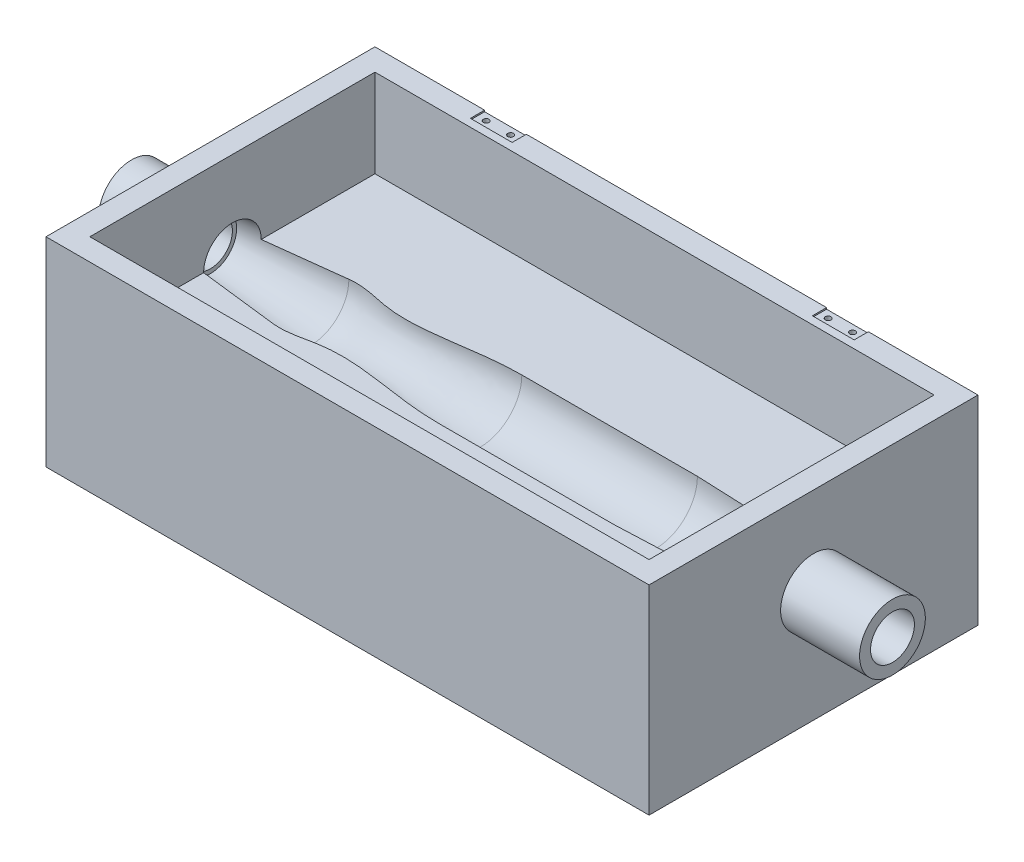
ISO-10303-21;
HEADER;
FILE_DESCRIPTION(('STEP AP214'),'2;1');
FILE_NAME('part.step','',(''),(''),'','','');
FILE_SCHEMA(('AUTOMOTIVE_DESIGN { 1 0 10303 214 1 1 1 1 }'));
ENDSEC;
DATA;
#1=APPLICATION_CONTEXT('core data for automotive mechanical design processes');
#2=APPLICATION_PROTOCOL_DEFINITION('international standard','automotive_design',2000,#1);
#3=PRODUCT_CONTEXT('',#1,'mechanical');
#4=PRODUCT('Part','Part','',(#3));
#5=PRODUCT_RELATED_PRODUCT_CATEGORY('part','',(#4));
#6=PRODUCT_DEFINITION_FORMATION('','',#4);
#7=PRODUCT_DEFINITION_CONTEXT('part definition',#1,'design');
#8=PRODUCT_DEFINITION('design','',#6,#7);
#9=PRODUCT_DEFINITION_SHAPE('','',#8);
#10=(LENGTH_UNIT() NAMED_UNIT(*) SI_UNIT(.MILLI.,.METRE.));
#11=(NAMED_UNIT(*) PLANE_ANGLE_UNIT() SI_UNIT($,.RADIAN.));
#12=(NAMED_UNIT(*) SI_UNIT($,.STERADIAN.) SOLID_ANGLE_UNIT());
#13=UNCERTAINTY_MEASURE_WITH_UNIT(LENGTH_MEASURE(1.E-05),#10,'distance_accuracy_value','');
#14=(GEOMETRIC_REPRESENTATION_CONTEXT(3) GLOBAL_UNCERTAINTY_ASSIGNED_CONTEXT((#13)) GLOBAL_UNIT_ASSIGNED_CONTEXT((#10,
#11,#12)) REPRESENTATION_CONTEXT('',''));
#15=CARTESIAN_POINT('',(0.,0.,0.));
#16=DIRECTION('',(0.,0.,1.));
#17=DIRECTION('',(1.,0.,0.));
#18=AXIS2_PLACEMENT_3D('',#15,#16,#17);
#19=CARTESIAN_POINT('',(137.5,0.,-75.));
#20=DIRECTION('',(1.,0.,0.));
#21=DIRECTION('',(0.,0.,-1.));
#22=AXIS2_PLACEMENT_3D('',#19,#20,#21);
#23=PLANE('',#22);
#24=CARTESIAN_POINT('',(137.5,0.,0.));
#25=DIRECTION('',(-1.,0.,0.));
#26=DIRECTION('',(0.,-1.,0.));
#27=AXIS2_PLACEMENT_3D('',#24,#25,#26);
#28=CIRCLE('',#27,7.747);
#29=CARTESIAN_POINT('',(137.5,-7.74699999999995,0.));
#30=VERTEX_POINT('',#29);
#31=EDGE_CURVE('E424',#30,#30,#28,.T.);
#32=ORIENTED_EDGE('',*,*,#31,.T.);
#33=EDGE_LOOP('',(#32));
#34=FACE_BOUND('',#33,.T.);
#35=CARTESIAN_POINT('',(137.5,0.,0.));
#36=DIRECTION('',(1.,0.,0.));
#37=DIRECTION('',(0.,0.,-1.));
#38=AXIS2_PLACEMENT_3D('',#35,#36,#37);
#39=CIRCLE('',#38,10.);
#40=CARTESIAN_POINT('',(137.5,0.,-10.));
#41=VERTEX_POINT('',#40);
#42=EDGE_CURVE('E53',#41,#41,#39,.F.);
#43=ORIENTED_EDGE('',*,*,#42,.F.);
#44=EDGE_LOOP('',(#43));
#45=FACE_BOUND('',#44,.T.);
#46=ADVANCED_FACE('F44',(#34,#45),#23,.T.);
#47=CARTESIAN_POINT('',(-137.5,0.,-75.));
#48=DIRECTION('',(0.,1.,0.));
#49=DIRECTION('',(-1.,0.,0.));
#50=AXIS2_PLACEMENT_3D('',#47,#48,#49);
#51=PLANE('',#50);
#52=DIRECTION('',(0.,0.,1.));
#53=VECTOR('',#52,1.);
#54=CARTESIAN_POINT('',(-127.5,0.,-65.));
#55=LINE('',#54,#53);
#56=CARTESIAN_POINT('',(-127.5,0.,-65.));
#57=VERTEX_POINT('',#56);
#58=CARTESIAN_POINT('',(-127.5,0.,-13.1324444444444));
#59=VERTEX_POINT('',#58);
#60=EDGE_CURVE('E565',#57,#59,#55,.T.);
#61=ORIENTED_EDGE('',*,*,#60,.T.);
#62=DIRECTION('',(-0.992941946001955,0.,0.118601399105789));
#63=VECTOR('',#62,1.);
#64=CARTESIAN_POINT('',(-237.446046511628,0.,0.));
#65=LINE('',#64,#63);
#66=CARTESIAN_POINT('',(-91.78,0.,-17.399));
#67=VERTEX_POINT('',#66);
#68=EDGE_CURVE('E429',#59,#67,#65,.F.);
#69=ORIENTED_EDGE('',*,*,#68,.T.);
#70=CARTESIAN_POINT('',(-14.564,0.,-19.05));
#71=CARTESIAN_POINT('',(-35.8294470897162,0.,-19.05));
#72=CARTESIAN_POINT('',(-60.549292723355,0.,-10.0128053188379));
#73=CARTESIAN_POINT('',(-84.9013365409294,0.,-18.220618135389));
#74=CARTESIAN_POINT('',(-91.78,0.,-17.399));
#75=B_SPLINE_CURVE_WITH_KNOTS('',3,(#70,#71,#72,#73,#74),.UNSPECIFIED.,.F.,.F.,(4,1,4),(0.,
0.755761848674318,1.),.UNSPECIFIED.);
#76=CARTESIAN_POINT('',(-14.564,0.,-19.05));
#77=VERTEX_POINT('',#76);
#78=EDGE_CURVE('E451',#67,#77,#75,.F.);
#79=ORIENTED_EDGE('',*,*,#78,.T.);
#80=DIRECTION('',(-1.,0.,0.));
#81=VECTOR('',#80,1.);
#82=CARTESIAN_POINT('',(-137.5,0.,-19.05));
#83=LINE('',#82,#81);
#84=CARTESIAN_POINT('',(65.5,0.,-19.05));
#85=VERTEX_POINT('',#84);
#86=EDGE_CURVE('E447',#77,#85,#83,.F.);
#87=ORIENTED_EDGE('',*,*,#86,.T.);
#88=DIRECTION('',(-0.999108513517014,0.,-0.0422158526838177));
#89=VECTOR('',#88,1.);
#90=CARTESIAN_POINT('',(516.349999999998,1.31985331754756E-13,0.));
#91=LINE('',#90,#89);
#92=CARTESIAN_POINT('',(119.602,0.,-16.764));
#93=VERTEX_POINT('',#92);
#94=EDGE_CURVE('E440',#85,#93,#91,.F.);
#95=ORIENTED_EDGE('',*,*,#94,.T.);
#96=CARTESIAN_POINT('',(137.5,0.,-7.747));
#97=CARTESIAN_POINT('',(137.5,0.,-12.322795174278));
#98=CARTESIAN_POINT('',(132.251729161469,0.,-15.7307599018355));
#99=CARTESIAN_POINT('',(126.446685513367,0.,-16.4747879360549));
#100=CARTESIAN_POINT('',(119.602,0.,-16.764));
#101=B_SPLINE_CURVE_WITH_KNOTS('',3,(#96,#97,#98,#99,#100),.UNSPECIFIED.,.F.,.F.,(4,1,4),(0.,
0.343752138132964,1.),.UNSPECIFIED.);
#102=CARTESIAN_POINT('',(127.5,0.,-16.1305760059969));
#103=VERTEX_POINT('',#102);
#104=EDGE_CURVE('E432',#93,#103,#101,.F.);
#105=ORIENTED_EDGE('',*,*,#104,.T.);
#106=DIRECTION('',(0.,0.,-1.));
#107=VECTOR('',#106,1.);
#108=CARTESIAN_POINT('',(127.5,0.,65.));
#109=LINE('',#108,#107);
#110=CARTESIAN_POINT('',(127.5,0.,-65.));
#111=VERTEX_POINT('',#110);
#112=EDGE_CURVE('E561',#103,#111,#109,.T.);
#113=ORIENTED_EDGE('',*,*,#112,.T.);
#114=DIRECTION('',(-1.,0.,0.));
#115=VECTOR('',#114,1.);
#116=CARTESIAN_POINT('',(-127.5,0.,-65.));
#117=LINE('',#116,#115);
#118=EDGE_CURVE('E553',#111,#57,#117,.T.);
#119=ORIENTED_EDGE('',*,*,#118,.T.);
#120=EDGE_LOOP('',(#61,#69,#79,#87,#95,#105,#113,#119));
#121=FACE_BOUND('',#120,.T.);
#122=ADVANCED_FACE('F406',(#121),#51,.T.);
#123=CARTESIAN_POINT('',(-14.564,0.,19.05));
#124=CARTESIAN_POINT('',(-35.8294470897162,0.,19.05));
#125=CARTESIAN_POINT('',(-60.549292723355,0.,10.0128053188379));
#126=CARTESIAN_POINT('',(-84.9013365409294,0.,18.220618135389));
#127=CARTESIAN_POINT('',(-91.78,0.,17.399));
#128=B_SPLINE_CURVE_WITH_KNOTS('',3,(#123,#124,#125,#126,#127),.UNSPECIFIED.,.F.,.F.,(4,1,4),
(0.,0.755761848674318,1.),.UNSPECIFIED.);
#129=CARTESIAN_POINT('',(-14.564,0.,19.05));
#130=VERTEX_POINT('',#129);
#131=CARTESIAN_POINT('',(-91.78,0.,17.399));
#132=VERTEX_POINT('',#131);
#133=EDGE_CURVE('E481',#130,#132,#128,.T.);
#134=ORIENTED_EDGE('',*,*,#133,.T.);
#135=DIRECTION('',(0.992941946001955,0.,0.118601399105789));
#136=VECTOR('',#135,1.);
#137=CARTESIAN_POINT('',(-237.446046511628,0.,0.));
#138=LINE('',#137,#136);
#139=CARTESIAN_POINT('',(-127.5,0.,13.1324444444444));
#140=VERTEX_POINT('',#139);
#141=EDGE_CURVE('E457',#132,#140,#138,.F.);
#142=ORIENTED_EDGE('',*,*,#141,.T.);
#143=CARTESIAN_POINT('',(-127.5,0.,65.));
#144=VERTEX_POINT('',#143);
#145=EDGE_CURVE('E569',#140,#144,#55,.T.);
#146=ORIENTED_EDGE('',*,*,#145,.T.);
#147=DIRECTION('',(1.,0.,0.));
#148=VECTOR('',#147,1.);
#149=CARTESIAN_POINT('',(-127.5,0.,65.));
#150=LINE('',#149,#148);
#151=CARTESIAN_POINT('',(127.5,0.,65.));
#152=VERTEX_POINT('',#151);
#153=EDGE_CURVE('E562',#144,#152,#150,.T.);
#154=ORIENTED_EDGE('',*,*,#153,.T.);
#155=CARTESIAN_POINT('',(127.500000000005,0.,16.1305760059962));
#156=VERTEX_POINT('',#155);
#157=EDGE_CURVE('E557',#152,#156,#109,.T.);
#158=ORIENTED_EDGE('',*,*,#157,.T.);
#159=CARTESIAN_POINT('',(137.5,0.,7.747));
#160=CARTESIAN_POINT('',(137.5,0.,12.322795174278));
#161=CARTESIAN_POINT('',(132.251729161469,0.,15.7307599018355));
#162=CARTESIAN_POINT('',(126.446685513367,0.,16.4747879360549));
#163=CARTESIAN_POINT('',(119.602,0.,16.764));
#164=B_SPLINE_CURVE_WITH_KNOTS('',3,(#159,#160,#161,#162,#163),.UNSPECIFIED.,.F.,.F.,(4,1,4),
(0.,0.343752138132964,1.),.UNSPECIFIED.);
#165=CARTESIAN_POINT('',(119.602,0.,16.764));
#166=VERTEX_POINT('',#165);
#167=EDGE_CURVE('E464',#156,#166,#164,.T.);
#168=ORIENTED_EDGE('',*,*,#167,.T.);
#169=DIRECTION('',(0.999108513517014,0.,-0.0422158526838177));
#170=VECTOR('',#169,1.);
#171=CARTESIAN_POINT('',(516.349999999998,1.31985331754756E-13,0.));
#172=LINE('',#171,#170);
#173=CARTESIAN_POINT('',(65.5,0.,19.05));
#174=VERTEX_POINT('',#173);
#175=EDGE_CURVE('E470',#166,#174,#172,.F.);
#176=ORIENTED_EDGE('',*,*,#175,.T.);
#177=DIRECTION('',(-1.,0.,0.));
#178=VECTOR('',#177,1.);
#179=CARTESIAN_POINT('',(-137.5,0.,19.05));
#180=LINE('',#179,#178);
#181=EDGE_CURVE('E477',#174,#130,#180,.T.);
#182=ORIENTED_EDGE('',*,*,#181,.T.);
#183=EDGE_LOOP('',(#134,#142,#146,#154,#158,#168,#176,#182));
#184=FACE_BOUND('',#183,.T.);
#185=ADVANCED_FACE('F408',(#184),#51,.T.);
#186=CARTESIAN_POINT('',(137.5,-50.8,-75.));
#187=DIRECTION('',(0.,-1.,0.));
#188=DIRECTION('',(1.,0.,0.));
#189=AXIS2_PLACEMENT_3D('',#186,#187,#188);
#190=PLANE('',#189);
#191=DIRECTION('',(0.,0.,1.));
#192=VECTOR('',#191,1.);
#193=CARTESIAN_POINT('',(137.5,-50.8,-75.));
#194=LINE('',#193,#192);
#195=CARTESIAN_POINT('',(137.5,-50.8,-75.));
#196=VERTEX_POINT('',#195);
#197=CARTESIAN_POINT('',(137.5,-50.8,75.));
#198=VERTEX_POINT('',#197);
#199=EDGE_CURVE('E488',#196,#198,#194,.T.);
#200=ORIENTED_EDGE('',*,*,#199,.T.);
#201=DIRECTION('',(1.,0.,0.));
#202=VECTOR('',#201,1.);
#203=CARTESIAN_POINT('',(137.5,-50.8,75.));
#204=LINE('',#203,#202);
#205=CARTESIAN_POINT('',(-137.5,-50.8,75.));
#206=VERTEX_POINT('',#205);
#207=EDGE_CURVE('E514',#206,#198,#204,.T.);
#208=ORIENTED_EDGE('',*,*,#207,.F.);
#209=DIRECTION('',(0.,0.,1.));
#210=VECTOR('',#209,1.);
#211=CARTESIAN_POINT('',(-137.5,-50.8,-75.));
#212=LINE('',#211,#210);
#213=CARTESIAN_POINT('',(-137.5,-50.8,-75.));
#214=VERTEX_POINT('',#213);
#215=EDGE_CURVE('E487',#214,#206,#212,.T.);
#216=ORIENTED_EDGE('',*,*,#215,.F.);
#217=DIRECTION('',(1.,0.,0.));
#218=VECTOR('',#217,1.);
#219=CARTESIAN_POINT('',(137.5,-50.8,-75.));
#220=LINE('',#219,#218);
#221=EDGE_CURVE('E503',#214,#196,#220,.T.);
#222=ORIENTED_EDGE('',*,*,#221,.T.);
#223=EDGE_LOOP('',(#200,#208,#216,#222));
#224=FACE_BOUND('',#223,.T.);
#225=ADVANCED_FACE('F46',(#224),#190,.T.);
#226=CARTESIAN_POINT('',(-137.5,-50.8,-75.));
#227=DIRECTION('',(-1.,0.,0.));
#228=DIRECTION('',(0.,0.,1.));
#229=AXIS2_PLACEMENT_3D('',#226,#227,#228);
#230=PLANE('',#229);
#231=CARTESIAN_POINT('',(-137.5,0.,0.));
#232=DIRECTION('',(-1.,0.,0.));
#233=DIRECTION('',(0.,0.,1.));
#234=AXIS2_PLACEMENT_3D('',#231,#232,#233);
#235=CIRCLE('',#234,15.);
#236=CARTESIAN_POINT('',(-137.5,0.,15.));
#237=VERTEX_POINT('',#236);
#238=EDGE_CURVE('E11',#237,#237,#235,.T.);
#239=ORIENTED_EDGE('',*,*,#238,.F.);
#240=EDGE_LOOP('',(#239));
#241=FACE_BOUND('',#240,.T.);
#242=ORIENTED_EDGE('',*,*,#215,.T.);
#243=DIRECTION('',(0.,-1.,0.));
#244=VECTOR('',#243,1.);
#245=CARTESIAN_POINT('',(-137.5,-50.8,75.));
#246=LINE('',#245,#244);
#247=CARTESIAN_POINT('',(-137.5,40.132,75.));
#248=VERTEX_POINT('',#247);
#249=EDGE_CURVE('E507',#248,#206,#246,.T.);
#250=ORIENTED_EDGE('',*,*,#249,.F.);
#251=DIRECTION('',(0.,0.,1.));
#252=VECTOR('',#251,1.);
#253=CARTESIAN_POINT('',(-137.5,40.132,-75.));
#254=LINE('',#253,#252);
#255=CARTESIAN_POINT('',(-137.5,40.132,-75.));
#256=VERTEX_POINT('',#255);
#257=EDGE_CURVE('E532',#256,#248,#254,.T.);
#258=ORIENTED_EDGE('',*,*,#257,.F.);
#259=DIRECTION('',(0.,-1.,0.));
#260=VECTOR('',#259,1.);
#261=CARTESIAN_POINT('',(-137.5,-50.8,-75.));
#262=LINE('',#261,#260);
#263=EDGE_CURVE('E494',#256,#214,#262,.T.);
#264=ORIENTED_EDGE('',*,*,#263,.T.);
#265=EDGE_LOOP('',(#242,#250,#258,#264));
#266=FACE_BOUND('',#265,.T.);
#267=ADVANCED_FACE('F402',(#241,#266),#230,.T.);
#268=CARTESIAN_POINT('',(137.5,0.,0.));
#269=DIRECTION('',(1.,0.,0.));
#270=DIRECTION('',(0.,0.,-1.));
#271=AXIS2_PLACEMENT_3D('',#268,#269,#270);
#272=CIRCLE('',#271,15.);
#273=CARTESIAN_POINT('',(137.5,0.,-15.));
#274=VERTEX_POINT('',#273);
#275=EDGE_CURVE('E341',#274,#274,#272,.T.);
#276=ORIENTED_EDGE('',*,*,#275,.F.);
#277=EDGE_LOOP('',(#276));
#278=FACE_BOUND('',#277,.T.);
#279=DIRECTION('',(0.,1.,0.));
#280=VECTOR('',#279,1.);
#281=CARTESIAN_POINT('',(137.5,0.,-75.));
#282=LINE('',#281,#280);
#283=CARTESIAN_POINT('',(137.5,40.132,-75.));
#284=VERTEX_POINT('',#283);
#285=EDGE_CURVE('E500',#196,#284,#282,.T.);
#286=ORIENTED_EDGE('',*,*,#285,.T.);
#287=DIRECTION('',(0.,0.,-1.));
#288=VECTOR('',#287,1.);
#289=CARTESIAN_POINT('',(137.5,40.132,75.));
#290=LINE('',#289,#288);
#291=CARTESIAN_POINT('',(137.5,40.132,75.));
#292=VERTEX_POINT('',#291);
#293=EDGE_CURVE('E524',#292,#284,#290,.T.);
#294=ORIENTED_EDGE('',*,*,#293,.F.);
#295=DIRECTION('',(0.,1.,0.));
#296=VECTOR('',#295,1.);
#297=CARTESIAN_POINT('',(137.5,0.,75.));
#298=LINE('',#297,#296);
#299=EDGE_CURVE('E511',#198,#292,#298,.T.);
#300=ORIENTED_EDGE('',*,*,#299,.F.);
#301=ORIENTED_EDGE('',*,*,#199,.F.);
#302=EDGE_LOOP('',(#286,#294,#300,#301));
#303=FACE_BOUND('',#302,.T.);
#304=ADVANCED_FACE('F400',(#278,#303),#23,.T.);
#305=CARTESIAN_POINT('',(0.,0.,-75.));
#306=DIRECTION('',(0.,0.,-1.));
#307=DIRECTION('',(-1.,0.,0.));
#308=AXIS2_PLACEMENT_3D('',#305,#306,#307);
#309=PLANE('',#308);
#310=DIRECTION('',(0.,1.,0.));
#311=VECTOR('',#310,1.);
#312=CARTESIAN_POINT('',(-87.5,39.492,-75.));
#313=LINE('',#312,#311);
#314=CARTESIAN_POINT('',(-87.5,39.492,-75.));
#315=VERTEX_POINT('',#314);
#316=CARTESIAN_POINT('',(-87.5,40.132,-75.));
#317=VERTEX_POINT('',#316);
#318=EDGE_CURVE('E272',#315,#317,#313,.T.);
#319=ORIENTED_EDGE('',*,*,#318,.F.);
#320=DIRECTION('',(-1.,0.,0.));
#321=VECTOR('',#320,1.);
#322=CARTESIAN_POINT('',(-87.5,39.492,-75.));
#323=LINE('',#322,#321);
#324=CARTESIAN_POINT('',(-68.45,39.492,-75.));
#325=VERTEX_POINT('',#324);
#326=EDGE_CURVE('E259',#325,#315,#323,.T.);
#327=ORIENTED_EDGE('',*,*,#326,.F.);
#328=DIRECTION('',(0.,1.,0.));
#329=VECTOR('',#328,1.);
#330=CARTESIAN_POINT('',(-68.45,39.492,-75.));
#331=LINE('',#330,#329);
#332=CARTESIAN_POINT('',(-68.45,40.132,-75.));
#333=VERTEX_POINT('',#332);
#334=EDGE_CURVE('E276',#325,#333,#331,.T.);
#335=ORIENTED_EDGE('',*,*,#334,.T.);
#336=DIRECTION('',(-1.,0.,0.));
#337=VECTOR('',#336,1.);
#338=CARTESIAN_POINT('',(-137.5,40.132,-75.));
#339=LINE('',#338,#337);
#340=CARTESIAN_POINT('',(68.45,40.132,-75.));
#341=VERTEX_POINT('',#340);
#342=EDGE_CURVE('E522',#341,#333,#339,.T.);
#343=ORIENTED_EDGE('',*,*,#342,.F.);
#344=DIRECTION('',(0.,1.,0.));
#345=VECTOR('',#344,1.);
#346=CARTESIAN_POINT('',(68.45,39.492,-75.));
#347=LINE('',#346,#345);
#348=CARTESIAN_POINT('',(68.45,39.492,-75.));
#349=VERTEX_POINT('',#348);
#350=EDGE_CURVE('E245',#349,#341,#347,.T.);
#351=ORIENTED_EDGE('',*,*,#350,.F.);
#352=DIRECTION('',(-1.,0.,0.));
#353=VECTOR('',#352,1.);
#354=CARTESIAN_POINT('',(68.45,39.492,-75.));
#355=LINE('',#354,#353);
#356=CARTESIAN_POINT('',(87.5,39.492,-75.));
#357=VERTEX_POINT('',#356);
#358=EDGE_CURVE('E288',#357,#349,#355,.T.);
#359=ORIENTED_EDGE('',*,*,#358,.F.);
#360=DIRECTION('',(0.,1.,0.));
#361=VECTOR('',#360,1.);
#362=CARTESIAN_POINT('',(87.5,39.492,-75.));
#363=LINE('',#362,#361);
#364=CARTESIAN_POINT('',(87.5,40.132,-75.));
#365=VERTEX_POINT('',#364);
#366=EDGE_CURVE('E292',#357,#365,#363,.T.);
#367=ORIENTED_EDGE('',*,*,#366,.T.);
#368=EDGE_CURVE('E518',#284,#365,#339,.T.);
#369=ORIENTED_EDGE('',*,*,#368,.F.);
#370=ORIENTED_EDGE('',*,*,#285,.F.);
#371=ORIENTED_EDGE('',*,*,#221,.F.);
#372=ORIENTED_EDGE('',*,*,#263,.F.);
#373=EDGE_CURVE('E523',#317,#256,#339,.T.);
#374=ORIENTED_EDGE('',*,*,#373,.F.);
#375=EDGE_LOOP('',(#319,#327,#335,#343,#351,#359,#367,#369,#370,#371,#372,#374));
#376=FACE_BOUND('',#375,.T.);
#377=ADVANCED_FACE('F396',(#376),#309,.T.);
#378=CARTESIAN_POINT('',(0.,0.,75.));
#379=DIRECTION('',(0.,0.,-1.));
#380=DIRECTION('',(-1.,0.,0.));
#381=AXIS2_PLACEMENT_3D('',#378,#379,#380);
#382=PLANE('',#381);
#383=ORIENTED_EDGE('',*,*,#207,.T.);
#384=ORIENTED_EDGE('',*,*,#299,.T.);
#385=DIRECTION('',(1.,0.,0.));
#386=VECTOR('',#385,1.);
#387=CARTESIAN_POINT('',(-137.5,40.132,75.));
#388=LINE('',#387,#386);
#389=EDGE_CURVE('E528',#248,#292,#388,.T.);
#390=ORIENTED_EDGE('',*,*,#389,.F.);
#391=ORIENTED_EDGE('',*,*,#249,.T.);
#392=EDGE_LOOP('',(#383,#384,#390,#391));
#393=FACE_BOUND('',#392,.T.);
#394=ADVANCED_FACE('F392',(#393),#382,.F.);
#395=CARTESIAN_POINT('',(0.,40.132,0.));
#396=DIRECTION('',(0.,1.,0.));
#397=DIRECTION('',(-1.,0.,0.));
#398=AXIS2_PLACEMENT_3D('',#395,#396,#397);
#399=PLANE('',#398);
#400=DIRECTION('',(0.,0.,1.));
#401=VECTOR('',#400,1.);
#402=CARTESIAN_POINT('',(-87.5,40.132,-75.));
#403=LINE('',#402,#401);
#404=CARTESIAN_POINT('',(-87.5,40.132,-68.52));
#405=VERTEX_POINT('',#404);
#406=EDGE_CURVE('E60',#317,#405,#403,.T.);
#407=ORIENTED_EDGE('',*,*,#406,.F.);
#408=ORIENTED_EDGE('',*,*,#373,.T.);
#409=ORIENTED_EDGE('',*,*,#257,.T.);
#410=ORIENTED_EDGE('',*,*,#389,.T.);
#411=ORIENTED_EDGE('',*,*,#293,.T.);
#412=ORIENTED_EDGE('',*,*,#368,.T.);
#413=DIRECTION('',(0.,0.,-1.));
#414=VECTOR('',#413,1.);
#415=CARTESIAN_POINT('',(87.5,40.132,-75.));
#416=LINE('',#415,#414);
#417=CARTESIAN_POINT('',(87.5,40.132,-68.52));
#418=VERTEX_POINT('',#417);
#419=EDGE_CURVE('E298',#418,#365,#416,.T.);
#420=ORIENTED_EDGE('',*,*,#419,.F.);
#421=DIRECTION('',(1.,0.,0.));
#422=VECTOR('',#421,1.);
#423=CARTESIAN_POINT('',(68.45,40.132,-68.52));
#424=LINE('',#423,#422);
#425=CARTESIAN_POINT('',(68.45,40.132,-68.52));
#426=VERTEX_POINT('',#425);
#427=EDGE_CURVE('E301',#426,#418,#424,.T.);
#428=ORIENTED_EDGE('',*,*,#427,.F.);
#429=DIRECTION('',(0.,0.,1.));
#430=VECTOR('',#429,1.);
#431=CARTESIAN_POINT('',(68.45,40.132,-75.));
#432=LINE('',#431,#430);
#433=EDGE_CURVE('E68',#341,#426,#432,.T.);
#434=ORIENTED_EDGE('',*,*,#433,.F.);
#435=ORIENTED_EDGE('',*,*,#342,.T.);
#436=DIRECTION('',(0.,0.,-1.));
#437=VECTOR('',#436,1.);
#438=CARTESIAN_POINT('',(-68.45,40.132,-75.));
#439=LINE('',#438,#437);
#440=CARTESIAN_POINT('',(-68.45,40.132,-68.52));
#441=VERTEX_POINT('',#440);
#442=EDGE_CURVE('E251',#441,#333,#439,.T.);
#443=ORIENTED_EDGE('',*,*,#442,.F.);
#444=DIRECTION('',(1.,0.,0.));
#445=VECTOR('',#444,1.);
#446=CARTESIAN_POINT('',(-87.5,40.132,-68.52));
#447=LINE('',#446,#445);
#448=EDGE_CURVE('E266',#405,#441,#447,.T.);
#449=ORIENTED_EDGE('',*,*,#448,.F.);
#450=EDGE_LOOP('',(#407,#408,#409,#410,#411,#412,#420,#428,#434,#435,#443,#449));
#451=FACE_BOUND('',#450,.T.);
#452=DIRECTION('',(1.,0.,0.));
#453=VECTOR('',#452,1.);
#454=CARTESIAN_POINT('',(-127.5,40.132,65.));
#455=LINE('',#454,#453);
#456=CARTESIAN_POINT('',(-127.5,40.132,65.));
#457=VERTEX_POINT('',#456);
#458=CARTESIAN_POINT('',(127.5,40.132,65.));
#459=VERTEX_POINT('',#458);
#460=EDGE_CURVE('E576',#457,#459,#455,.T.);
#461=ORIENTED_EDGE('',*,*,#460,.F.);
#462=DIRECTION('',(0.,0.,1.));
#463=VECTOR('',#462,1.);
#464=CARTESIAN_POINT('',(-127.5,40.132,-65.));
#465=LINE('',#464,#463);
#466=CARTESIAN_POINT('',(-127.5,40.132,-65.));
#467=VERTEX_POINT('',#466);
#468=EDGE_CURVE('E556',#467,#457,#465,.T.);
#469=ORIENTED_EDGE('',*,*,#468,.F.);
#470=DIRECTION('',(-1.,0.,0.));
#471=VECTOR('',#470,1.);
#472=CARTESIAN_POINT('',(-127.5,40.132,-65.));
#473=LINE('',#472,#471);
#474=CARTESIAN_POINT('',(127.5,40.132,-65.));
#475=VERTEX_POINT('',#474);
#476=EDGE_CURVE('E552',#475,#467,#473,.T.);
#477=ORIENTED_EDGE('',*,*,#476,.F.);
#478=DIRECTION('',(0.,0.,-1.));
#479=VECTOR('',#478,1.);
#480=CARTESIAN_POINT('',(127.5,40.132,65.));
#481=LINE('',#480,#479);
#482=EDGE_CURVE('E572',#459,#475,#481,.T.);
#483=ORIENTED_EDGE('',*,*,#482,.F.);
#484=EDGE_LOOP('',(#461,#469,#477,#483));
#485=FACE_BOUND('',#484,.T.);
#486=ADVANCED_FACE('F388',(#451,#485),#399,.T.);
#487=CARTESIAN_POINT('',(-127.5,40.132,-65.));
#488=DIRECTION('',(1.,0.,0.));
#489=DIRECTION('',(0.,1.,0.));
#490=AXIS2_PLACEMENT_3D('',#487,#488,#489);
#491=PLANE('',#490);
#492=ORIENTED_EDGE('',*,*,#145,.F.);
#493=CARTESIAN_POINT('',(-127.5,0.,0.));
#494=DIRECTION('',(1.,0.,0.));
#495=DIRECTION('',(0.,1.,0.));
#496=AXIS2_PLACEMENT_3D('',#493,#494,#495);
#497=CIRCLE('',#496,13.1324444444444);
#498=EDGE_CURVE('E581',#140,#59,#497,.F.);
#499=ORIENTED_EDGE('',*,*,#498,.T.);
#500=ORIENTED_EDGE('',*,*,#60,.F.);
#501=DIRECTION('',(0.,-1.,0.));
#502=VECTOR('',#501,1.);
#503=CARTESIAN_POINT('',(-127.5,40.132,-65.));
#504=LINE('',#503,#502);
#505=EDGE_CURVE('E548',#467,#57,#504,.T.);
#506=ORIENTED_EDGE('',*,*,#505,.F.);
#507=ORIENTED_EDGE('',*,*,#468,.T.);
#508=DIRECTION('',(0.,-1.,0.));
#509=VECTOR('',#508,1.);
#510=CARTESIAN_POINT('',(-127.5,40.132,65.));
#511=LINE('',#510,#509);
#512=EDGE_CURVE('E536',#457,#144,#511,.T.);
#513=ORIENTED_EDGE('',*,*,#512,.T.);
#514=EDGE_LOOP('',(#492,#499,#500,#506,#507,#513));
#515=FACE_BOUND('',#514,.T.);
#516=ADVANCED_FACE('F384',(#515),#491,.T.);
#517=CARTESIAN_POINT('',(-127.5,40.132,65.));
#518=DIRECTION('',(0.,0.,-1.));
#519=DIRECTION('',(-1.,0.,0.));
#520=AXIS2_PLACEMENT_3D('',#517,#518,#519);
#521=PLANE('',#520);
#522=ORIENTED_EDGE('',*,*,#153,.F.);
#523=ORIENTED_EDGE('',*,*,#512,.F.);
#524=ORIENTED_EDGE('',*,*,#460,.T.);
#525=DIRECTION('',(0.,-1.,0.));
#526=VECTOR('',#525,1.);
#527=CARTESIAN_POINT('',(127.5,40.132,65.));
#528=LINE('',#527,#526);
#529=EDGE_CURVE('E540',#459,#152,#528,.T.);
#530=ORIENTED_EDGE('',*,*,#529,.T.);
#531=EDGE_LOOP('',(#522,#523,#524,#530));
#532=FACE_BOUND('',#531,.T.);
#533=ADVANCED_FACE('F380',(#532),#521,.T.);
#534=CARTESIAN_POINT('',(127.5,40.132,65.));
#535=DIRECTION('',(-1.,0.,0.));
#536=DIRECTION('',(0.,-1.,0.));
#537=AXIS2_PLACEMENT_3D('',#534,#535,#536);
#538=PLANE('',#537);
#539=ORIENTED_EDGE('',*,*,#112,.F.);
#540=CARTESIAN_POINT('',(127.5,0.,0.));
#541=DIRECTION('',(-1.,0.,0.));
#542=DIRECTION('',(0.,-1.,0.));
#543=AXIS2_PLACEMENT_3D('',#540,#541,#542);
#544=CIRCLE('',#543,16.1305760059969);
#545=EDGE_CURVE('E585',#103,#156,#544,.F.);
#546=ORIENTED_EDGE('',*,*,#545,.T.);
#547=ORIENTED_EDGE('',*,*,#157,.F.);
#548=ORIENTED_EDGE('',*,*,#529,.F.);
#549=ORIENTED_EDGE('',*,*,#482,.T.);
#550=DIRECTION('',(0.,-1.,0.));
#551=VECTOR('',#550,1.);
#552=CARTESIAN_POINT('',(127.5,40.132,-65.));
#553=LINE('',#552,#551);
#554=EDGE_CURVE('E544',#475,#111,#553,.T.);
#555=ORIENTED_EDGE('',*,*,#554,.T.);
#556=EDGE_LOOP('',(#539,#546,#547,#548,#549,#555));
#557=FACE_BOUND('',#556,.T.);
#558=ADVANCED_FACE('F376',(#557),#538,.T.);
#559=CARTESIAN_POINT('',(-127.5,40.132,-65.));
#560=DIRECTION('',(0.,0.,1.));
#561=DIRECTION('',(1.,0.,0.));
#562=AXIS2_PLACEMENT_3D('',#559,#560,#561);
#563=PLANE('',#562);
#564=ORIENTED_EDGE('',*,*,#118,.F.);
#565=ORIENTED_EDGE('',*,*,#554,.F.);
#566=ORIENTED_EDGE('',*,*,#476,.T.);
#567=ORIENTED_EDGE('',*,*,#505,.T.);
#568=EDGE_LOOP('',(#564,#565,#566,#567));
#569=FACE_BOUND('',#568,.T.);
#570=ADVANCED_FACE('F372',(#569),#563,.T.);
#571=CARTESIAN_POINT('',(-91.78,0.,0.));
#572=DIRECTION('',(1.,0.,0.));
#573=DIRECTION('',(0.,1.,0.));
#574=AXIS2_PLACEMENT_3D('',#571,#572,#573);
#575=CONICAL_SURFACE('',#574,17.399,0.11888122095754);
#576=CARTESIAN_POINT('',(-137.5,0.,0.));
#577=DIRECTION('',(-1.,0.,0.));
#578=DIRECTION('',(0.,0.,1.));
#579=AXIS2_PLACEMENT_3D('',#576,#577,#578);
#580=CIRCLE('',#579,11.938);
#581=CARTESIAN_POINT('',(-137.5,0.,11.938));
#582=VERTEX_POINT('',#581);
#583=EDGE_CURVE('E333',#582,#582,#580,.T.);
#584=ORIENTED_EDGE('',*,*,#583,.T.);
#585=EDGE_LOOP('',(#584));
#586=FACE_BOUND('',#585,.T.);
#587=CARTESIAN_POINT('',(-91.78,0.,0.));
#588=DIRECTION('',(-1.,0.,0.));
#589=DIRECTION('',(0.,-1.,0.));
#590=AXIS2_PLACEMENT_3D('',#587,#588,#589);
#591=CIRCLE('',#590,17.399);
#592=EDGE_CURVE('E346',#67,#132,#591,.T.);
#593=ORIENTED_EDGE('',*,*,#592,.F.);
#594=ORIENTED_EDGE('',*,*,#68,.F.);
#595=ORIENTED_EDGE('',*,*,#498,.F.);
#596=ORIENTED_EDGE('',*,*,#141,.F.);
#597=EDGE_LOOP('',(#593,#594,#595,#596));
#598=FACE_BOUND('',#597,.T.);
#599=ADVANCED_FACE('F367',(#586,#598),#575,.F.);
#600=CARTESIAN_POINT('',(137.5,7.74700000000005,0.));
#601=CARTESIAN_POINT('',(137.5,12.322795174278,0.));
#602=CARTESIAN_POINT('',(132.251729161469,15.7307599018356,0.));
#603=CARTESIAN_POINT('',(126.446685513367,16.4747879360549,0.));
#604=CARTESIAN_POINT('',(119.602,16.764,0.));
#605=B_SPLINE_CURVE_WITH_KNOTS('',3,(#600,#601,#602,#603,#604),.UNSPECIFIED.,.F.,.F.,(4,1,4),
(0.,0.343752138132964,1.),.UNSPECIFIED.);
#606=CARTESIAN_POINT('',(-137.5,0.,0.));
#607=DIRECTION('',(-1.,0.,0.));
#608=AXIS1_PLACEMENT('',#606,#607);
#609=SURFACE_OF_REVOLUTION('',#605,#608);
#610=CARTESIAN_POINT('',(119.602,0.,0.));
#611=DIRECTION('',(-1.,0.,0.));
#612=DIRECTION('',(0.,-1.,0.));
#613=AXIS2_PLACEMENT_3D('',#610,#611,#612);
#614=CIRCLE('',#613,16.764);
#615=EDGE_CURVE('E591',#93,#166,#614,.T.);
#616=ORIENTED_EDGE('',*,*,#615,.T.);
#617=ORIENTED_EDGE('',*,*,#167,.F.);
#618=ORIENTED_EDGE('',*,*,#545,.F.);
#619=ORIENTED_EDGE('',*,*,#104,.F.);
#620=EDGE_LOOP('',(#616,#617,#618,#619));
#621=FACE_BOUND('',#620,.T.);
#622=ORIENTED_EDGE('',*,*,#31,.F.);
#623=EDGE_LOOP('',(#622));
#624=FACE_BOUND('',#623,.T.);
#625=ADVANCED_FACE('F362',(#621,#624),#609,.F.);
#626=CARTESIAN_POINT('',(119.602,0.,0.));
#627=DIRECTION('',(-1.,0.,0.));
#628=DIRECTION('',(0.,-1.,0.));
#629=AXIS2_PLACEMENT_3D('',#626,#627,#628);
#630=CONICAL_SURFACE('',#629,16.764,0.042228402113002);
#631=CARTESIAN_POINT('',(65.5,0.,0.));
#632=DIRECTION('',(-1.,0.,0.));
#633=DIRECTION('',(0.,-1.,0.));
#634=AXIS2_PLACEMENT_3D('',#631,#632,#633);
#635=CIRCLE('',#634,19.05);
#636=EDGE_CURVE('E595',#85,#174,#635,.T.);
#637=ORIENTED_EDGE('',*,*,#636,.T.);
#638=ORIENTED_EDGE('',*,*,#175,.F.);
#639=ORIENTED_EDGE('',*,*,#615,.F.);
#640=ORIENTED_EDGE('',*,*,#94,.F.);
#641=EDGE_LOOP('',(#637,#638,#639,#640));
#642=FACE_BOUND('',#641,.T.);
#643=ADVANCED_FACE('F366',(#642),#630,.F.);
#644=CARTESIAN_POINT('',(-137.5,0.,0.));
#645=DIRECTION('',(-1.,0.,0.));
#646=DIRECTION('',(0.,-1.,0.));
#647=AXIS2_PLACEMENT_3D('',#644,#645,#646);
#648=CYLINDRICAL_SURFACE('',#647,19.05);
#649=CARTESIAN_POINT('',(-14.564,0.,0.));
#650=DIRECTION('',(-1.,0.,0.));
#651=DIRECTION('',(0.,-1.,0.));
#652=AXIS2_PLACEMENT_3D('',#649,#650,#651);
#653=CIRCLE('',#652,19.05);
#654=EDGE_CURVE('E599',#77,#130,#653,.T.);
#655=ORIENTED_EDGE('',*,*,#654,.T.);
#656=ORIENTED_EDGE('',*,*,#181,.F.);
#657=ORIENTED_EDGE('',*,*,#636,.F.);
#658=ORIENTED_EDGE('',*,*,#86,.F.);
#659=EDGE_LOOP('',(#655,#656,#657,#658));
#660=FACE_BOUND('',#659,.T.);
#661=ADVANCED_FACE('F613',(#660),#648,.F.);
#662=CARTESIAN_POINT('',(-14.564,19.05,0.));
#663=CARTESIAN_POINT('',(-35.8294470897163,19.05,0.));
#664=CARTESIAN_POINT('',(-60.549292723355,10.0128053188379,0.));
#665=CARTESIAN_POINT('',(-84.9013365409294,18.220618135389,0.));
#666=CARTESIAN_POINT('',(-91.78,17.399,0.));
#667=B_SPLINE_CURVE_WITH_KNOTS('',3,(#662,#663,#664,#665,#666),.UNSPECIFIED.,.F.,.F.,(4,1,4),
(0.,0.755761848674318,1.),.UNSPECIFIED.);
#668=CARTESIAN_POINT('',(-137.5,0.,0.));
#669=DIRECTION('',(-1.,0.,0.));
#670=AXIS1_PLACEMENT('',#668,#669);
#671=SURFACE_OF_REVOLUTION('',#667,#670);
#672=ORIENTED_EDGE('',*,*,#592,.T.);
#673=ORIENTED_EDGE('',*,*,#133,.F.);
#674=ORIENTED_EDGE('',*,*,#654,.F.);
#675=ORIENTED_EDGE('',*,*,#78,.F.);
#676=EDGE_LOOP('',(#672,#673,#674,#675));
#677=FACE_BOUND('',#676,.T.);
#678=ADVANCED_FACE('F606',(#677),#671,.F.);
#679=CARTESIAN_POINT('',(173.5,0.,0.));
#680=DIRECTION('',(1.,0.,0.));
#681=DIRECTION('',(0.,0.,-1.));
#682=AXIS2_PLACEMENT_3D('',#679,#680,#681);
#683=PLANE('',#682);
#684=CARTESIAN_POINT('',(173.5,0.,0.));
#685=DIRECTION('',(1.,0.,0.));
#686=DIRECTION('',(0.,0.,-1.));
#687=AXIS2_PLACEMENT_3D('',#684,#685,#686);
#688=CIRCLE('',#687,15.);
#689=CARTESIAN_POINT('',(173.5,0.,-15.));
#690=VERTEX_POINT('',#689);
#691=EDGE_CURVE('E342',#690,#690,#688,.T.);
#692=ORIENTED_EDGE('',*,*,#691,.T.);
#693=EDGE_LOOP('',(#692));
#694=FACE_BOUND('',#693,.T.);
#695=CARTESIAN_POINT('',(173.5,0.,0.));
#696=DIRECTION('',(1.,0.,0.));
#697=DIRECTION('',(0.,0.,-1.));
#698=AXIS2_PLACEMENT_3D('',#695,#696,#697);
#699=CIRCLE('',#698,10.);
#700=CARTESIAN_POINT('',(173.5,0.,-10.));
#701=VERTEX_POINT('',#700);
#702=EDGE_CURVE('E337',#701,#701,#699,.T.);
#703=ORIENTED_EDGE('',*,*,#702,.F.);
#704=EDGE_LOOP('',(#703));
#705=FACE_BOUND('',#704,.T.);
#706=ADVANCED_FACE('F788',(#694,#705),#683,.T.);
#707=CARTESIAN_POINT('',(173.5,0.,0.));
#708=DIRECTION('',(-1.,0.,0.));
#709=DIRECTION('',(0.,0.,1.));
#710=AXIS2_PLACEMENT_3D('',#707,#708,#709);
#711=CYLINDRICAL_SURFACE('',#710,15.);
#712=ORIENTED_EDGE('',*,*,#691,.F.);
#713=EDGE_LOOP('',(#712));
#714=FACE_BOUND('',#713,.T.);
#715=ORIENTED_EDGE('',*,*,#275,.T.);
#716=EDGE_LOOP('',(#715));
#717=FACE_BOUND('',#716,.T.);
#718=ADVANCED_FACE('F806',(#714,#717),#711,.T.);
#719=CARTESIAN_POINT('',(173.5,0.,0.));
#720=DIRECTION('',(-1.,0.,0.));
#721=DIRECTION('',(0.,0.,1.));
#722=AXIS2_PLACEMENT_3D('',#719,#720,#721);
#723=CYLINDRICAL_SURFACE('',#722,10.);
#724=ORIENTED_EDGE('',*,*,#702,.T.);
#725=EDGE_LOOP('',(#724));
#726=FACE_BOUND('',#725,.T.);
#727=ORIENTED_EDGE('',*,*,#42,.T.);
#728=EDGE_LOOP('',(#727));
#729=FACE_BOUND('',#728,.T.);
#730=ADVANCED_FACE('F817',(#726,#729),#723,.F.);
#731=CARTESIAN_POINT('',(-137.5,0.,0.));
#732=DIRECTION('',(-1.,0.,0.));
#733=DIRECTION('',(0.,0.,-1.));
#734=AXIS2_PLACEMENT_3D('',#731,#732,#733);
#735=PLANE('',#734);
#736=CARTESIAN_POINT('',(-137.5,0.,0.));
#737=DIRECTION('',(1.,0.,0.));
#738=DIRECTION('',(0.,0.,-1.));
#739=AXIS2_PLACEMENT_3D('',#736,#737,#738);
#740=CIRCLE('',#739,10.);
#741=CARTESIAN_POINT('',(-137.5,0.,-10.));
#742=VERTEX_POINT('',#741);
#743=EDGE_CURVE('E275',#742,#742,#740,.T.);
#744=ORIENTED_EDGE('',*,*,#743,.F.);
#745=EDGE_LOOP('',(#744));
#746=FACE_BOUND('',#745,.T.);
#747=ORIENTED_EDGE('',*,*,#583,.F.);
#748=EDGE_LOOP('',(#747));
#749=FACE_BOUND('',#748,.T.);
#750=ADVANCED_FACE('F828',(#746,#749),#735,.F.);
#751=CARTESIAN_POINT('',(-173.5,0.,0.));
#752=DIRECTION('',(1.,0.,0.));
#753=DIRECTION('',(0.,0.,-1.));
#754=AXIS2_PLACEMENT_3D('',#751,#752,#753);
#755=CYLINDRICAL_SURFACE('',#754,15.);
#756=CARTESIAN_POINT('',(-173.5,0.,0.));
#757=DIRECTION('',(1.,0.,0.));
#758=DIRECTION('',(0.,0.,-1.));
#759=AXIS2_PLACEMENT_3D('',#756,#757,#758);
#760=CIRCLE('',#759,15.);
#761=CARTESIAN_POINT('',(-173.5,0.,-15.));
#762=VERTEX_POINT('',#761);
#763=EDGE_CURVE('E326',#762,#762,#760,.T.);
#764=ORIENTED_EDGE('',*,*,#763,.T.);
#765=EDGE_LOOP('',(#764));
#766=FACE_BOUND('',#765,.T.);
#767=ORIENTED_EDGE('',*,*,#238,.T.);
#768=EDGE_LOOP('',(#767));
#769=FACE_BOUND('',#768,.T.);
#770=ADVANCED_FACE('F839',(#766,#769),#755,.T.);
#771=CARTESIAN_POINT('',(-173.5,0.,0.));
#772=DIRECTION('',(-1.,0.,0.));
#773=DIRECTION('',(0.,0.,-1.));
#774=AXIS2_PLACEMENT_3D('',#771,#772,#773);
#775=PLANE('',#774);
#776=CARTESIAN_POINT('',(-173.5,0.,0.));
#777=DIRECTION('',(1.,0.,0.));
#778=DIRECTION('',(0.,0.,-1.));
#779=AXIS2_PLACEMENT_3D('',#776,#777,#778);
#780=CIRCLE('',#779,10.);
#781=CARTESIAN_POINT('',(-173.5,0.,-10.));
#782=VERTEX_POINT('',#781);
#783=EDGE_CURVE('E322',#782,#782,#780,.T.);
#784=ORIENTED_EDGE('',*,*,#783,.T.);
#785=EDGE_LOOP('',(#784));
#786=FACE_BOUND('',#785,.T.);
#787=ORIENTED_EDGE('',*,*,#763,.F.);
#788=EDGE_LOOP('',(#787));
#789=FACE_BOUND('',#788,.T.);
#790=ADVANCED_FACE('F850',(#786,#789),#775,.T.);
#791=CARTESIAN_POINT('',(-173.5,0.,0.));
#792=DIRECTION('',(1.,0.,0.));
#793=DIRECTION('',(0.,0.,-1.));
#794=AXIS2_PLACEMENT_3D('',#791,#792,#793);
#795=CYLINDRICAL_SURFACE('',#794,10.);
#796=ORIENTED_EDGE('',*,*,#783,.F.);
#797=EDGE_LOOP('',(#796));
#798=FACE_BOUND('',#797,.T.);
#799=ORIENTED_EDGE('',*,*,#743,.T.);
#800=EDGE_LOOP('',(#799));
#801=FACE_BOUND('',#800,.T.);
#802=ADVANCED_FACE('F861',(#798,#801),#795,.F.);
#803=CARTESIAN_POINT('',(68.45,39.492,-75.));
#804=DIRECTION('',(-1.,0.,0.));
#805=DIRECTION('',(0.,-1.,0.));
#806=AXIS2_PLACEMENT_3D('',#803,#804,#805);
#807=PLANE('',#806);
#808=ORIENTED_EDGE('',*,*,#433,.T.);
#809=DIRECTION('',(0.,1.,0.));
#810=VECTOR('',#809,1.);
#811=CARTESIAN_POINT('',(68.45,39.492,-68.52));
#812=LINE('',#811,#810);
#813=CARTESIAN_POINT('',(68.45,39.492,-68.52));
#814=VERTEX_POINT('',#813);
#815=EDGE_CURVE('E285',#814,#426,#812,.T.);
#816=ORIENTED_EDGE('',*,*,#815,.F.);
#817=DIRECTION('',(0.,0.,1.));
#818=VECTOR('',#817,1.);
#819=CARTESIAN_POINT('',(68.45,39.492,-75.));
#820=LINE('',#819,#818);
#821=EDGE_CURVE('E302',#349,#814,#820,.T.);
#822=ORIENTED_EDGE('',*,*,#821,.F.);
#823=ORIENTED_EDGE('',*,*,#350,.T.);
#824=EDGE_LOOP('',(#808,#816,#822,#823));
#825=FACE_BOUND('',#824,.T.);
#826=ADVANCED_FACE('F872',(#825),#807,.F.);
#827=CARTESIAN_POINT('',(87.5,39.492,-75.));
#828=DIRECTION('',(1.,0.,0.));
#829=DIRECTION('',(0.,1.,0.));
#830=AXIS2_PLACEMENT_3D('',#827,#828,#829);
#831=PLANE('',#830);
#832=ORIENTED_EDGE('',*,*,#419,.T.);
#833=ORIENTED_EDGE('',*,*,#366,.F.);
#834=DIRECTION('',(0.,0.,-1.));
#835=VECTOR('',#834,1.);
#836=CARTESIAN_POINT('',(87.5,39.492,-75.));
#837=LINE('',#836,#835);
#838=CARTESIAN_POINT('',(87.5,39.492,-68.52));
#839=VERTEX_POINT('',#838);
#840=EDGE_CURVE('E311',#839,#357,#837,.T.);
#841=ORIENTED_EDGE('',*,*,#840,.F.);
#842=DIRECTION('',(0.,1.,0.));
#843=VECTOR('',#842,1.);
#844=CARTESIAN_POINT('',(87.5,39.492,-68.52));
#845=LINE('',#844,#843);
#846=EDGE_CURVE('E289',#839,#418,#845,.T.);
#847=ORIENTED_EDGE('',*,*,#846,.T.);
#848=EDGE_LOOP('',(#832,#833,#841,#847));
#849=FACE_BOUND('',#848,.T.);
#850=ADVANCED_FACE('F883',(#849),#831,.F.);
#851=CARTESIAN_POINT('',(68.45,39.492,-68.52));
#852=DIRECTION('',(0.,0.,1.));
#853=DIRECTION('',(1.,0.,0.));
#854=AXIS2_PLACEMENT_3D('',#851,#852,#853);
#855=PLANE('',#854);
#856=ORIENTED_EDGE('',*,*,#427,.T.);
#857=ORIENTED_EDGE('',*,*,#846,.F.);
#858=DIRECTION('',(1.,0.,0.));
#859=VECTOR('',#858,1.);
#860=CARTESIAN_POINT('',(68.45,39.492,-68.52));
#861=LINE('',#860,#859);
#862=EDGE_CURVE('E315',#814,#839,#861,.T.);
#863=ORIENTED_EDGE('',*,*,#862,.F.);
#864=ORIENTED_EDGE('',*,*,#815,.T.);
#865=EDGE_LOOP('',(#856,#857,#863,#864));
#866=FACE_BOUND('',#865,.T.);
#867=ADVANCED_FACE('F893',(#866),#855,.F.);
#868=CARTESIAN_POINT('',(0.,39.492,0.));
#869=DIRECTION('',(0.,1.,0.));
#870=DIRECTION('',(-1.,0.,0.));
#871=AXIS2_PLACEMENT_3D('',#868,#869,#870);
#872=PLANE('',#871);
#873=CARTESIAN_POINT('',(72.41,39.492,-71.76));
#874=DIRECTION('',(0.,1.,0.));
#875=DIRECTION('',(0.,0.,1.));
#876=AXIS2_PLACEMENT_3D('',#873,#874,#875);
#877=CIRCLE('',#876,1.3);
#878=CARTESIAN_POINT('',(72.41,39.492,-70.46));
#879=VERTEX_POINT('',#878);
#880=EDGE_CURVE('E229',#879,#879,#877,.T.);
#881=ORIENTED_EDGE('',*,*,#880,.F.);
#882=EDGE_LOOP('',(#881));
#883=FACE_BOUND('',#882,.T.);
#884=CARTESIAN_POINT('',(83.54,39.492,-71.76));
#885=DIRECTION('',(0.,1.,0.));
#886=DIRECTION('',(0.,0.,1.));
#887=AXIS2_PLACEMENT_3D('',#884,#885,#886);
#888=CIRCLE('',#887,1.3);
#889=CARTESIAN_POINT('',(83.54,39.492,-70.46));
#890=VERTEX_POINT('',#889);
#891=EDGE_CURVE('E237',#890,#890,#888,.T.);
#892=ORIENTED_EDGE('',*,*,#891,.F.);
#893=EDGE_LOOP('',(#892));
#894=FACE_BOUND('',#893,.T.);
#895=ORIENTED_EDGE('',*,*,#821,.T.);
#896=ORIENTED_EDGE('',*,*,#862,.T.);
#897=ORIENTED_EDGE('',*,*,#840,.T.);
#898=ORIENTED_EDGE('',*,*,#358,.T.);
#899=EDGE_LOOP('',(#895,#896,#897,#898));
#900=FACE_BOUND('',#899,.T.);
#901=ADVANCED_FACE('F904',(#883,#894,#900),#872,.T.);
#902=CARTESIAN_POINT('',(-87.5,39.492,-75.));
#903=DIRECTION('',(-1.,0.,0.));
#904=DIRECTION('',(0.,-1.,0.));
#905=AXIS2_PLACEMENT_3D('',#902,#903,#904);
#906=PLANE('',#905);
#907=ORIENTED_EDGE('',*,*,#406,.T.);
#908=DIRECTION('',(0.,1.,0.));
#909=VECTOR('',#908,1.);
#910=CARTESIAN_POINT('',(-87.5,39.492,-68.52));
#911=LINE('',#910,#909);
#912=CARTESIAN_POINT('',(-87.5,39.492,-68.52));
#913=VERTEX_POINT('',#912);
#914=EDGE_CURVE('E263',#913,#405,#911,.T.);
#915=ORIENTED_EDGE('',*,*,#914,.F.);
#916=DIRECTION('',(0.,0.,1.));
#917=VECTOR('',#916,1.);
#918=CARTESIAN_POINT('',(-87.5,39.492,-75.));
#919=LINE('',#918,#917);
#920=EDGE_CURVE('E246',#315,#913,#919,.T.);
#921=ORIENTED_EDGE('',*,*,#920,.F.);
#922=ORIENTED_EDGE('',*,*,#318,.T.);
#923=EDGE_LOOP('',(#907,#915,#921,#922));
#924=FACE_BOUND('',#923,.T.);
#925=ADVANCED_FACE('F916',(#924),#906,.F.);
#926=CARTESIAN_POINT('',(-68.45,39.492,-75.));
#927=DIRECTION('',(1.,0.,0.));
#928=DIRECTION('',(0.,1.,0.));
#929=AXIS2_PLACEMENT_3D('',#926,#927,#928);
#930=PLANE('',#929);
#931=ORIENTED_EDGE('',*,*,#442,.T.);
#932=ORIENTED_EDGE('',*,*,#334,.F.);
#933=DIRECTION('',(0.,0.,-1.));
#934=VECTOR('',#933,1.);
#935=CARTESIAN_POINT('',(-68.45,39.492,-75.));
#936=LINE('',#935,#934);
#937=CARTESIAN_POINT('',(-68.45,39.492,-68.52));
#938=VERTEX_POINT('',#937);
#939=EDGE_CURVE('E255',#938,#325,#936,.T.);
#940=ORIENTED_EDGE('',*,*,#939,.F.);
#941=DIRECTION('',(0.,1.,0.));
#942=VECTOR('',#941,1.);
#943=CARTESIAN_POINT('',(-68.45,39.492,-68.52));
#944=LINE('',#943,#942);
#945=EDGE_CURVE('E280',#938,#441,#944,.T.);
#946=ORIENTED_EDGE('',*,*,#945,.T.);
#947=EDGE_LOOP('',(#931,#932,#940,#946));
#948=FACE_BOUND('',#947,.T.);
#949=ADVANCED_FACE('F637',(#948),#930,.F.);
#950=CARTESIAN_POINT('',(-87.5,39.492,-68.52));
#951=DIRECTION('',(0.,0.,1.));
#952=DIRECTION('',(1.,0.,0.));
#953=AXIS2_PLACEMENT_3D('',#950,#951,#952);
#954=PLANE('',#953);
#955=ORIENTED_EDGE('',*,*,#448,.T.);
#956=ORIENTED_EDGE('',*,*,#945,.F.);
#957=DIRECTION('',(1.,0.,0.));
#958=VECTOR('',#957,1.);
#959=CARTESIAN_POINT('',(-87.5,39.492,-68.52));
#960=LINE('',#959,#958);
#961=EDGE_CURVE('E250',#913,#938,#960,.T.);
#962=ORIENTED_EDGE('',*,*,#961,.F.);
#963=ORIENTED_EDGE('',*,*,#914,.T.);
#964=EDGE_LOOP('',(#955,#956,#962,#963));
#965=FACE_BOUND('',#964,.T.);
#966=ADVANCED_FACE('F642',(#965),#954,.F.);
#967=CARTESIAN_POINT('',(0.,39.492,0.));
#968=DIRECTION('',(0.,1.,0.));
#969=DIRECTION('',(-1.,0.,0.));
#970=AXIS2_PLACEMENT_3D('',#967,#968,#969);
#971=PLANE('',#970);
#972=CARTESIAN_POINT('',(-83.54,39.492,-71.76));
#973=DIRECTION('',(0.,1.,0.));
#974=DIRECTION('',(0.,0.,1.));
#975=AXIS2_PLACEMENT_3D('',#972,#973,#974);
#976=CIRCLE('',#975,1.3);
#977=CARTESIAN_POINT('',(-83.54,39.492,-70.46));
#978=VERTEX_POINT('',#977);
#979=EDGE_CURVE('E216',#978,#978,#976,.T.);
#980=ORIENTED_EDGE('',*,*,#979,.F.);
#981=EDGE_LOOP('',(#980));
#982=FACE_BOUND('',#981,.T.);
#983=CARTESIAN_POINT('',(-72.41,39.492,-71.76));
#984=DIRECTION('',(0.,1.,0.));
#985=DIRECTION('',(0.,0.,1.));
#986=AXIS2_PLACEMENT_3D('',#983,#984,#985);
#987=CIRCLE('',#986,1.3);
#988=CARTESIAN_POINT('',(-72.41,39.492,-70.46));
#989=VERTEX_POINT('',#988);
#990=EDGE_CURVE('E215',#989,#989,#987,.T.);
#991=ORIENTED_EDGE('',*,*,#990,.F.);
#992=EDGE_LOOP('',(#991));
#993=FACE_BOUND('',#992,.T.);
#994=ORIENTED_EDGE('',*,*,#920,.T.);
#995=ORIENTED_EDGE('',*,*,#961,.T.);
#996=ORIENTED_EDGE('',*,*,#939,.T.);
#997=ORIENTED_EDGE('',*,*,#326,.T.);
#998=EDGE_LOOP('',(#994,#995,#996,#997));
#999=FACE_BOUND('',#998,.T.);
#1000=ADVANCED_FACE('F639',(#982,#993,#999),#971,.T.);
#1001=CARTESIAN_POINT('',(83.54,37.492,-71.76));
#1002=DIRECTION('',(0.,1.,0.));
#1003=DIRECTION('',(0.,0.,1.));
#1004=AXIS2_PLACEMENT_3D('',#1001,#1002,#1003);
#1005=CONICAL_SURFACE('',#1004,1.3,1.02974425867665);
#1006=CARTESIAN_POINT('',(83.54,36.7108811952642,-71.76));
#1007=VERTEX_POINT('',#1006);
#1008=VERTEX_LOOP('',#1007);
#1009=FACE_BOUND('',#1008,.T.);
#1010=CARTESIAN_POINT('',(83.54,37.492,-71.76));
#1011=DIRECTION('',(0.,1.,0.));
#1012=DIRECTION('',(0.,0.,1.));
#1013=AXIS2_PLACEMENT_3D('',#1010,#1011,#1012);
#1014=CIRCLE('',#1013,1.3);
#1015=CARTESIAN_POINT('',(83.54,37.492,-70.46));
#1016=VERTEX_POINT('',#1015);
#1017=EDGE_CURVE('E241',#1016,#1016,#1014,.T.);
#1018=ORIENTED_EDGE('',*,*,#1017,.T.);
#1019=EDGE_LOOP('',(#1018));
#1020=FACE_BOUND('',#1019,.T.);
#1021=ADVANCED_FACE('F953',(#1009,#1020),#1005,.F.);
#1022=CARTESIAN_POINT('',(83.54,39.492,-71.76));
#1023=DIRECTION('',(0.,1.,0.));
#1024=DIRECTION('',(0.,0.,1.));
#1025=AXIS2_PLACEMENT_3D('',#1022,#1023,#1024);
#1026=CYLINDRICAL_SURFACE('',#1025,1.3);
#1027=ORIENTED_EDGE('',*,*,#1017,.F.);
#1028=EDGE_LOOP('',(#1027));
#1029=FACE_BOUND('',#1028,.T.);
#1030=ORIENTED_EDGE('',*,*,#891,.T.);
#1031=EDGE_LOOP('',(#1030));
#1032=FACE_BOUND('',#1031,.T.);
#1033=ADVANCED_FACE('F964',(#1029,#1032),#1026,.F.);
#1034=CARTESIAN_POINT('',(72.41,37.492,-71.76));
#1035=DIRECTION('',(0.,1.,0.));
#1036=DIRECTION('',(0.,0.,1.));
#1037=AXIS2_PLACEMENT_3D('',#1034,#1035,#1036);
#1038=CONICAL_SURFACE('',#1037,1.3,1.02974425867665);
#1039=CARTESIAN_POINT('',(72.41,36.7108811952642,-71.76));
#1040=VERTEX_POINT('',#1039);
#1041=VERTEX_LOOP('',#1040);
#1042=FACE_BOUND('',#1041,.T.);
#1043=CARTESIAN_POINT('',(72.41,37.492,-71.76));
#1044=DIRECTION('',(0.,1.,0.));
#1045=DIRECTION('',(0.,0.,1.));
#1046=AXIS2_PLACEMENT_3D('',#1043,#1044,#1045);
#1047=CIRCLE('',#1046,1.3);
#1048=CARTESIAN_POINT('',(72.41,37.492,-70.46));
#1049=VERTEX_POINT('',#1048);
#1050=EDGE_CURVE('E233',#1049,#1049,#1047,.T.);
#1051=ORIENTED_EDGE('',*,*,#1050,.T.);
#1052=EDGE_LOOP('',(#1051));
#1053=FACE_BOUND('',#1052,.T.);
#1054=ADVANCED_FACE('F975',(#1042,#1053),#1038,.F.);
#1055=CARTESIAN_POINT('',(72.41,39.492,-71.76));
#1056=DIRECTION('',(0.,1.,0.));
#1057=DIRECTION('',(0.,0.,1.));
#1058=AXIS2_PLACEMENT_3D('',#1055,#1056,#1057);
#1059=CYLINDRICAL_SURFACE('',#1058,1.3);
#1060=ORIENTED_EDGE('',*,*,#1050,.F.);
#1061=EDGE_LOOP('',(#1060));
#1062=FACE_BOUND('',#1061,.T.);
#1063=ORIENTED_EDGE('',*,*,#880,.T.);
#1064=EDGE_LOOP('',(#1063));
#1065=FACE_BOUND('',#1064,.T.);
#1066=ADVANCED_FACE('F986',(#1062,#1065),#1059,.F.);
#1067=CARTESIAN_POINT('',(-72.41,37.492,-71.76));
#1068=DIRECTION('',(0.,1.,0.));
#1069=DIRECTION('',(0.,0.,1.));
#1070=AXIS2_PLACEMENT_3D('',#1067,#1068,#1069);
#1071=CONICAL_SURFACE('',#1070,1.3,1.02974425867665);
#1072=CARTESIAN_POINT('',(-72.41,36.7108811952642,-71.76));
#1073=VERTEX_POINT('',#1072);
#1074=VERTEX_LOOP('',#1073);
#1075=FACE_BOUND('',#1074,.T.);
#1076=CARTESIAN_POINT('',(-72.41,37.492,-71.76));
#1077=DIRECTION('',(0.,1.,0.));
#1078=DIRECTION('',(0.,0.,1.));
#1079=AXIS2_PLACEMENT_3D('',#1076,#1077,#1078);
#1080=CIRCLE('',#1079,1.3);
#1081=CARTESIAN_POINT('',(-72.41,37.492,-70.46));
#1082=VERTEX_POINT('',#1081);
#1083=EDGE_CURVE('E221',#1082,#1082,#1080,.T.);
#1084=ORIENTED_EDGE('',*,*,#1083,.T.);
#1085=EDGE_LOOP('',(#1084));
#1086=FACE_BOUND('',#1085,.T.);
#1087=ADVANCED_FACE('F997',(#1075,#1086),#1071,.F.);
#1088=CARTESIAN_POINT('',(-72.41,39.492,-71.76));
#1089=DIRECTION('',(0.,1.,0.));
#1090=DIRECTION('',(0.,0.,1.));
#1091=AXIS2_PLACEMENT_3D('',#1088,#1089,#1090);
#1092=CYLINDRICAL_SURFACE('',#1091,1.3);
#1093=ORIENTED_EDGE('',*,*,#1083,.F.);
#1094=EDGE_LOOP('',(#1093));
#1095=FACE_BOUND('',#1094,.T.);
#1096=ORIENTED_EDGE('',*,*,#990,.T.);
#1097=EDGE_LOOP('',(#1096));
#1098=FACE_BOUND('',#1097,.T.);
#1099=ADVANCED_FACE('F208',(#1095,#1098),#1092,.F.);
#1100=CARTESIAN_POINT('',(-83.54,37.492,-71.76));
#1101=DIRECTION('',(0.,1.,0.));
#1102=DIRECTION('',(0.,0.,1.));
#1103=AXIS2_PLACEMENT_3D('',#1100,#1101,#1102);
#1104=CONICAL_SURFACE('',#1103,1.3,1.02974425867665);
#1105=CARTESIAN_POINT('',(-83.54,36.7108811952642,-71.76));
#1106=VERTEX_POINT('',#1105);
#1107=VERTEX_LOOP('',#1106);
#1108=FACE_BOUND('',#1107,.T.);
#1109=CARTESIAN_POINT('',(-83.54,37.492,-71.76));
#1110=DIRECTION('',(0.,1.,0.));
#1111=DIRECTION('',(0.,0.,1.));
#1112=AXIS2_PLACEMENT_3D('',#1109,#1110,#1111);
#1113=CIRCLE('',#1112,1.3);
#1114=CARTESIAN_POINT('',(-83.54,37.492,-70.46));
#1115=VERTEX_POINT('',#1114);
#1116=EDGE_CURVE('E212',#1115,#1115,#1113,.T.);
#1117=ORIENTED_EDGE('',*,*,#1116,.T.);
#1118=EDGE_LOOP('',(#1117));
#1119=FACE_BOUND('',#1118,.T.);
#1120=ADVANCED_FACE('F204',(#1108,#1119),#1104,.F.);
#1121=CARTESIAN_POINT('',(-83.54,39.492,-71.76));
#1122=DIRECTION('',(0.,1.,0.));
#1123=DIRECTION('',(0.,0.,1.));
#1124=AXIS2_PLACEMENT_3D('',#1121,#1122,#1123);
#1125=CYLINDRICAL_SURFACE('',#1124,1.3);
#1126=ORIENTED_EDGE('',*,*,#1116,.F.);
#1127=EDGE_LOOP('',(#1126));
#1128=FACE_BOUND('',#1127,.T.);
#1129=ORIENTED_EDGE('',*,*,#979,.T.);
#1130=EDGE_LOOP('',(#1129));
#1131=FACE_BOUND('',#1130,.T.);
#1132=ADVANCED_FACE('F207',(#1128,#1131),#1125,.F.);
#1133=CLOSED_SHELL('',(#46,#122,#185,#225,#267,#304,#377,#394,#486,#516,#533,#558,#570,#599,
#625,#643,#661,#678,#706,#718,#730,#750,#770,#790,#802,#826,#850,#867,#901,#925,#949,#966,#1000,
#1021,#1033,#1054,#1066,#1087,#1099,#1120,#1132));
#1134=MANIFOLD_SOLID_BREP('B2',#1133);
#1135=ADVANCED_BREP_SHAPE_REPRESENTATION('',(#18,#1134),#14);
#1136=SHAPE_DEFINITION_REPRESENTATION(#9,#1135);
ENDSEC;
END-ISO-10303-21;
